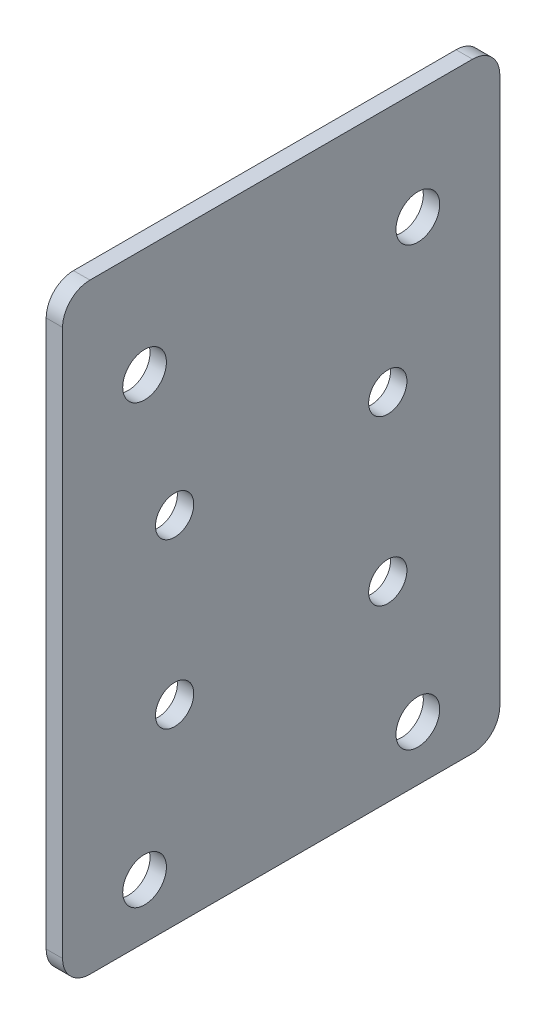
ISO-10303-21;
HEADER;
FILE_DESCRIPTION(('STEP AP214'),'2;1');
FILE_NAME('part.step','',(''),(''),'','','');
FILE_SCHEMA(('AUTOMOTIVE_DESIGN { 1 0 10303 214 1 1 1 1 }'));
ENDSEC;
DATA;
#1=APPLICATION_CONTEXT('core data for automotive mechanical design processes');
#2=APPLICATION_PROTOCOL_DEFINITION('international standard','automotive_design',2000,#1);
#3=PRODUCT_CONTEXT('',#1,'mechanical');
#4=PRODUCT('Part','Part','',(#3));
#5=PRODUCT_RELATED_PRODUCT_CATEGORY('part','',(#4));
#6=PRODUCT_DEFINITION_FORMATION('','',#4);
#7=PRODUCT_DEFINITION_CONTEXT('part definition',#1,'design');
#8=PRODUCT_DEFINITION('design','',#6,#7);
#9=PRODUCT_DEFINITION_SHAPE('','',#8);
#10=(LENGTH_UNIT() NAMED_UNIT(*) SI_UNIT(.MILLI.,.METRE.));
#11=(NAMED_UNIT(*) PLANE_ANGLE_UNIT() SI_UNIT($,.RADIAN.));
#12=(NAMED_UNIT(*) SI_UNIT($,.STERADIAN.) SOLID_ANGLE_UNIT());
#13=UNCERTAINTY_MEASURE_WITH_UNIT(LENGTH_MEASURE(1.E-05),#10,'distance_accuracy_value','');
#14=(GEOMETRIC_REPRESENTATION_CONTEXT(3) GLOBAL_UNCERTAINTY_ASSIGNED_CONTEXT((#13)) GLOBAL_UNIT_ASSIGNED_CONTEXT((#10,
#11,#12)) REPRESENTATION_CONTEXT('',''));
#15=CARTESIAN_POINT('',(0.,0.,0.));
#16=DIRECTION('',(0.,0.,1.));
#17=DIRECTION('',(1.,0.,0.));
#18=AXIS2_PLACEMENT_3D('',#15,#16,#17);
#19=CARTESIAN_POINT('',(0.,-23.2804933070191,40.));
#20=DIRECTION('',(0.,1.,0.));
#21=DIRECTION('',(0.,0.,1.));
#22=AXIS2_PLACEMENT_3D('',#19,#20,#21);
#23=PLANE('',#22);
#24=DIRECTION('',(0.,0.,-1.));
#25=VECTOR('',#24,1.);
#26=CARTESIAN_POINT('',(3.,-23.2804933070191,40.));
#27=LINE('',#26,#25);
#28=CARTESIAN_POINT('',(3.,-23.2804933070191,35.));
#29=VERTEX_POINT('',#28);
#30=CARTESIAN_POINT('',(3.,-23.2804933070191,-35.));
#31=VERTEX_POINT('',#30);
#32=EDGE_CURVE('E147',#29,#31,#27,.T.);
#33=ORIENTED_EDGE('',*,*,#32,.F.);
#34=DIRECTION('',(1.,0.,0.));
#35=VECTOR('',#34,1.);
#36=CARTESIAN_POINT('',(0.,-23.2804933070191,35.));
#37=LINE('',#36,#35);
#38=CARTESIAN_POINT('',(0.,-23.2804933070191,35.));
#39=VERTEX_POINT('',#38);
#40=EDGE_CURVE('E104',#29,#39,#37,.F.);
#41=ORIENTED_EDGE('',*,*,#40,.T.);
#42=DIRECTION('',(0.,0.,-1.));
#43=VECTOR('',#42,1.);
#44=CARTESIAN_POINT('',(0.,-23.2804933070191,40.));
#45=LINE('',#44,#43);
#46=CARTESIAN_POINT('',(0.,-23.2804933070191,-35.));
#47=VERTEX_POINT('',#46);
#48=EDGE_CURVE('E128',#39,#47,#45,.T.);
#49=ORIENTED_EDGE('',*,*,#48,.T.);
#50=DIRECTION('',(1.,0.,0.));
#51=VECTOR('',#50,1.);
#52=CARTESIAN_POINT('',(0.,-23.2804933070191,-35.));
#53=LINE('',#52,#51);
#54=EDGE_CURVE('E109',#47,#31,#53,.T.);
#55=ORIENTED_EDGE('',*,*,#54,.T.);
#56=EDGE_LOOP('',(#33,#41,#49,#55));
#57=FACE_BOUND('',#56,.T.);
#58=ADVANCED_FACE('F33',(#57),#23,.F.);
#59=CARTESIAN_POINT('',(3.,86.7195066929809,40.));
#60=DIRECTION('',(-1.,0.,0.));
#61=DIRECTION('',(0.,-1.,0.));
#62=AXIS2_PLACEMENT_3D('',#59,#60,#61);
#63=PLANE('',#62);
#64=CARTESIAN_POINT('',(3.00000000000004,66.7195066929809,24.9975001874844));
#65=DIRECTION('',(-1.,0.,0.));
#66=DIRECTION('',(0.,0.,1.));
#67=AXIS2_PLACEMENT_3D('',#64,#65,#66);
#68=CIRCLE('',#67,4.);
#69=CARTESIAN_POINT('',(3.00000000000004,66.7195066929809,28.9975001874844));
#70=VERTEX_POINT('',#69);
#71=EDGE_CURVE('E361',#70,#70,#68,.T.);
#72=ORIENTED_EDGE('',*,*,#71,.T.);
#73=EDGE_LOOP('',(#72));
#74=FACE_BOUND('',#73,.T.);
#75=CARTESIAN_POINT('',(3.00000000000004,-13.2804933070191,-25.));
#76=DIRECTION('',(-1.,0.,0.));
#77=DIRECTION('',(0.,0.,1.));
#78=AXIS2_PLACEMENT_3D('',#75,#76,#77);
#79=CIRCLE('',#78,4.);
#80=CARTESIAN_POINT('',(3.00000000000004,-13.2804933070191,-21.));
#81=VERTEX_POINT('',#80);
#82=EDGE_CURVE('E368',#81,#81,#79,.T.);
#83=ORIENTED_EDGE('',*,*,#82,.T.);
#84=EDGE_LOOP('',(#83));
#85=FACE_BOUND('',#84,.T.);
#86=CARTESIAN_POINT('',(3.00000000000004,-13.2804933070191,24.9975001874844));
#87=DIRECTION('',(-1.,0.,0.));
#88=DIRECTION('',(0.,0.,1.));
#89=AXIS2_PLACEMENT_3D('',#86,#87,#88);
#90=CIRCLE('',#89,4.);
#91=CARTESIAN_POINT('',(3.00000000000004,-13.2804933070191,28.9975001874844));
#92=VERTEX_POINT('',#91);
#93=EDGE_CURVE('E352',#92,#92,#90,.T.);
#94=ORIENTED_EDGE('',*,*,#93,.T.);
#95=EDGE_LOOP('',(#94));
#96=FACE_BOUND('',#95,.T.);
#97=CARTESIAN_POINT('',(3.00000000000004,66.7195066929809,-25.));
#98=DIRECTION('',(-1.,0.,0.));
#99=DIRECTION('',(0.,0.,1.));
#100=AXIS2_PLACEMENT_3D('',#97,#98,#99);
#101=CIRCLE('',#100,4.);
#102=CARTESIAN_POINT('',(3.00000000000004,66.7195066929809,-21.));
#103=VERTEX_POINT('',#102);
#104=EDGE_CURVE('E373',#103,#103,#101,.T.);
#105=ORIENTED_EDGE('',*,*,#104,.T.);
#106=EDGE_LOOP('',(#105));
#107=FACE_BOUND('',#106,.T.);
#108=CARTESIAN_POINT('',(3.00000000000004,41.7195066929809,19.5));
#109=DIRECTION('',(1.,0.,0.));
#110=DIRECTION('',(0.,0.,-1.));
#111=AXIS2_PLACEMENT_3D('',#108,#109,#110);
#112=CIRCLE('',#111,3.5);
#113=CARTESIAN_POINT('',(3.00000000000004,41.7195066929809,16.));
#114=VERTEX_POINT('',#113);
#115=EDGE_CURVE('E376',#114,#114,#112,.T.);
#116=ORIENTED_EDGE('',*,*,#115,.F.);
#117=EDGE_LOOP('',(#116));
#118=FACE_BOUND('',#117,.T.);
#119=CARTESIAN_POINT('',(3.00000000000004,41.719506692981,-19.5));
#120=DIRECTION('',(1.,0.,0.));
#121=DIRECTION('',(0.,0.,-1.));
#122=AXIS2_PLACEMENT_3D('',#119,#120,#121);
#123=CIRCLE('',#122,3.5);
#124=CARTESIAN_POINT('',(3.00000000000004,41.719506692981,-23.));
#125=VERTEX_POINT('',#124);
#126=EDGE_CURVE('E388',#125,#125,#123,.T.);
#127=ORIENTED_EDGE('',*,*,#126,.F.);
#128=EDGE_LOOP('',(#127));
#129=FACE_BOUND('',#128,.T.);
#130=CARTESIAN_POINT('',(3.00000000000004,11.7195066929809,-19.5));
#131=DIRECTION('',(1.,0.,0.));
#132=DIRECTION('',(0.,0.,-1.));
#133=AXIS2_PLACEMENT_3D('',#130,#131,#132);
#134=CIRCLE('',#133,3.5);
#135=CARTESIAN_POINT('',(3.00000000000004,11.7195066929809,-23.));
#136=VERTEX_POINT('',#135);
#137=EDGE_CURVE('E382',#136,#136,#134,.T.);
#138=ORIENTED_EDGE('',*,*,#137,.F.);
#139=EDGE_LOOP('',(#138));
#140=FACE_BOUND('',#139,.T.);
#141=CARTESIAN_POINT('',(3.00000000000004,11.7195066929809,19.5));
#142=DIRECTION('',(1.,0.,0.));
#143=DIRECTION('',(0.,0.,-1.));
#144=AXIS2_PLACEMENT_3D('',#141,#142,#143);
#145=CIRCLE('',#144,3.5);
#146=CARTESIAN_POINT('',(3.00000000000004,11.7195066929809,16.));
#147=VERTEX_POINT('',#146);
#148=EDGE_CURVE('E134',#147,#147,#145,.T.);
#149=ORIENTED_EDGE('',*,*,#148,.F.);
#150=EDGE_LOOP('',(#149));
#151=FACE_BOUND('',#150,.T.);
#152=DIRECTION('',(0.,1.,0.));
#153=VECTOR('',#152,1.);
#154=CARTESIAN_POINT('',(3.,-23.2804933070191,40.));
#155=LINE('',#154,#153);
#156=CARTESIAN_POINT('',(3.,-18.2804933070191,40.));
#157=VERTEX_POINT('',#156);
#158=CARTESIAN_POINT('',(3.,81.7195066929809,40.));
#159=VERTEX_POINT('',#158);
#160=EDGE_CURVE('E117',#157,#159,#155,.T.);
#161=ORIENTED_EDGE('',*,*,#160,.F.);
#162=CARTESIAN_POINT('',(3.00000000000004,-18.2804933070191,35.));
#163=DIRECTION('',(-1.,0.,0.));
#164=DIRECTION('',(0.,-1.,0.));
#165=AXIS2_PLACEMENT_3D('',#162,#163,#164);
#166=CIRCLE('',#165,5.);
#167=EDGE_CURVE('E99',#157,#29,#166,.F.);
#168=ORIENTED_EDGE('',*,*,#167,.T.);
#169=ORIENTED_EDGE('',*,*,#32,.T.);
#170=CARTESIAN_POINT('',(3.00000000000004,-18.2804933070191,-35.));
#171=DIRECTION('',(-1.,0.,0.));
#172=DIRECTION('',(0.,-1.,0.));
#173=AXIS2_PLACEMENT_3D('',#170,#171,#172);
#174=CIRCLE('',#173,5.);
#175=CARTESIAN_POINT('',(3.00000000000004,-18.2804933070191,-40.));
#176=VERTEX_POINT('',#175);
#177=EDGE_CURVE('E110',#31,#176,#174,.F.);
#178=ORIENTED_EDGE('',*,*,#177,.T.);
#179=DIRECTION('',(0.,1.,0.));
#180=VECTOR('',#179,1.);
#181=CARTESIAN_POINT('',(3.,86.7195066929809,-40.));
#182=LINE('',#181,#180);
#183=CARTESIAN_POINT('',(3.,81.7195066929809,-40.));
#184=VERTEX_POINT('',#183);
#185=EDGE_CURVE('E131',#176,#184,#182,.T.);
#186=ORIENTED_EDGE('',*,*,#185,.T.);
#187=CARTESIAN_POINT('',(3.,81.7195066929809,-35.));
#188=DIRECTION('',(-1.,0.,0.));
#189=DIRECTION('',(0.,-1.,0.));
#190=AXIS2_PLACEMENT_3D('',#187,#188,#189);
#191=CIRCLE('',#190,5.);
#192=CARTESIAN_POINT('',(3.,86.7195066929809,-35.));
#193=VERTEX_POINT('',#192);
#194=EDGE_CURVE('E151',#184,#193,#191,.F.);
#195=ORIENTED_EDGE('',*,*,#194,.T.);
#196=DIRECTION('',(0.,0.,-1.));
#197=VECTOR('',#196,1.);
#198=CARTESIAN_POINT('',(3.,86.7195066929809,40.));
#199=LINE('',#198,#197);
#200=CARTESIAN_POINT('',(3.,86.7195066929809,35.));
#201=VERTEX_POINT('',#200);
#202=EDGE_CURVE('E144',#201,#193,#199,.T.);
#203=ORIENTED_EDGE('',*,*,#202,.F.);
#204=CARTESIAN_POINT('',(3.,81.7195066929809,35.));
#205=DIRECTION('',(-1.,0.,0.));
#206=DIRECTION('',(0.,-1.,0.));
#207=AXIS2_PLACEMENT_3D('',#204,#205,#206);
#208=CIRCLE('',#207,5.);
#209=EDGE_CURVE('E120',#201,#159,#208,.F.);
#210=ORIENTED_EDGE('',*,*,#209,.T.);
#211=EDGE_LOOP('',(#161,#168,#169,#178,#186,#195,#203,#210));
#212=FACE_BOUND('',#211,.T.);
#213=ADVANCED_FACE('F123',(#74,#85,#96,#107,#118,#129,#140,#151,#212),#63,.F.);
#214=CARTESIAN_POINT('',(0.,86.7195066929809,40.));
#215=DIRECTION('',(0.,-1.,0.));
#216=DIRECTION('',(0.,0.,-1.));
#217=AXIS2_PLACEMENT_3D('',#214,#215,#216);
#218=PLANE('',#217);
#219=ORIENTED_EDGE('',*,*,#202,.T.);
#220=DIRECTION('',(-1.,0.,0.));
#221=VECTOR('',#220,1.);
#222=CARTESIAN_POINT('',(0.,86.7195066929809,-35.));
#223=LINE('',#222,#221);
#224=CARTESIAN_POINT('',(0.,86.7195066929809,-35.));
#225=VERTEX_POINT('',#224);
#226=EDGE_CURVE('E11',#193,#225,#223,.T.);
#227=ORIENTED_EDGE('',*,*,#226,.T.);
#228=DIRECTION('',(0.,0.,-1.));
#229=VECTOR('',#228,1.);
#230=CARTESIAN_POINT('',(0.,86.7195066929809,40.));
#231=LINE('',#230,#229);
#232=CARTESIAN_POINT('',(0.,86.7195066929809,35.));
#233=VERTEX_POINT('',#232);
#234=EDGE_CURVE('E142',#233,#225,#231,.T.);
#235=ORIENTED_EDGE('',*,*,#234,.F.);
#236=DIRECTION('',(-1.,0.,0.));
#237=VECTOR('',#236,1.);
#238=CARTESIAN_POINT('',(3.,86.7195066929809,35.));
#239=LINE('',#238,#237);
#240=EDGE_CURVE('E41',#233,#201,#239,.F.);
#241=ORIENTED_EDGE('',*,*,#240,.T.);
#242=EDGE_LOOP('',(#219,#227,#235,#241));
#243=FACE_BOUND('',#242,.T.);
#244=ADVANCED_FACE('F168',(#243),#218,.F.);
#245=CARTESIAN_POINT('',(0.,-23.2804933070191,40.));
#246=DIRECTION('',(1.,0.,0.));
#247=DIRECTION('',(0.,0.,-1.));
#248=AXIS2_PLACEMENT_3D('',#245,#246,#247);
#249=PLANE('',#248);
#250=CARTESIAN_POINT('',(0.,66.7195066929809,24.9975001874844));
#251=DIRECTION('',(-1.,0.,0.));
#252=DIRECTION('',(0.,0.,1.));
#253=AXIS2_PLACEMENT_3D('',#250,#251,#252);
#254=CIRCLE('',#253,4.);
#255=CARTESIAN_POINT('',(0.,66.7195066929809,28.9975001874844));
#256=VERTEX_POINT('',#255);
#257=EDGE_CURVE('E365',#256,#256,#254,.T.);
#258=ORIENTED_EDGE('',*,*,#257,.F.);
#259=EDGE_LOOP('',(#258));
#260=FACE_BOUND('',#259,.T.);
#261=CARTESIAN_POINT('',(0.,-13.2804933070191,-25.));
#262=DIRECTION('',(-1.,0.,0.));
#263=DIRECTION('',(0.,0.,1.));
#264=AXIS2_PLACEMENT_3D('',#261,#262,#263);
#265=CIRCLE('',#264,4.);
#266=CARTESIAN_POINT('',(0.,-13.2804933070191,-21.));
#267=VERTEX_POINT('',#266);
#268=EDGE_CURVE('E358',#267,#267,#265,.T.);
#269=ORIENTED_EDGE('',*,*,#268,.F.);
#270=EDGE_LOOP('',(#269));
#271=FACE_BOUND('',#270,.T.);
#272=CARTESIAN_POINT('',(0.,-13.2804933070191,24.9975001874844));
#273=DIRECTION('',(-1.,0.,0.));
#274=DIRECTION('',(0.,0.,1.));
#275=AXIS2_PLACEMENT_3D('',#272,#273,#274);
#276=CIRCLE('',#275,4.);
#277=CARTESIAN_POINT('',(0.,-13.2804933070191,28.9975001874844));
#278=VERTEX_POINT('',#277);
#279=EDGE_CURVE('E355',#278,#278,#276,.T.);
#280=ORIENTED_EDGE('',*,*,#279,.F.);
#281=EDGE_LOOP('',(#280));
#282=FACE_BOUND('',#281,.T.);
#283=CARTESIAN_POINT('',(0.,66.7195066929809,-25.));
#284=DIRECTION('',(-1.,0.,0.));
#285=DIRECTION('',(0.,0.,1.));
#286=AXIS2_PLACEMENT_3D('',#283,#284,#285);
#287=CIRCLE('',#286,4.);
#288=CARTESIAN_POINT('',(0.,66.7195066929809,-21.));
#289=VERTEX_POINT('',#288);
#290=EDGE_CURVE('E364',#289,#289,#287,.T.);
#291=ORIENTED_EDGE('',*,*,#290,.F.);
#292=EDGE_LOOP('',(#291));
#293=FACE_BOUND('',#292,.T.);
#294=CARTESIAN_POINT('',(0.,41.7195066929809,19.5));
#295=DIRECTION('',(1.,0.,0.));
#296=DIRECTION('',(0.,0.,-1.));
#297=AXIS2_PLACEMENT_3D('',#294,#295,#296);
#298=CIRCLE('',#297,3.5);
#299=CARTESIAN_POINT('',(0.,41.7195066929809,16.));
#300=VERTEX_POINT('',#299);
#301=EDGE_CURVE('E391',#300,#300,#298,.T.);
#302=ORIENTED_EDGE('',*,*,#301,.T.);
#303=EDGE_LOOP('',(#302));
#304=FACE_BOUND('',#303,.T.);
#305=CARTESIAN_POINT('',(0.,41.719506692981,-19.5));
#306=DIRECTION('',(1.,0.,0.));
#307=DIRECTION('',(0.,0.,-1.));
#308=AXIS2_PLACEMENT_3D('',#305,#306,#307);
#309=CIRCLE('',#308,3.5);
#310=CARTESIAN_POINT('',(0.,41.719506692981,-23.));
#311=VERTEX_POINT('',#310);
#312=EDGE_CURVE('E385',#311,#311,#309,.T.);
#313=ORIENTED_EDGE('',*,*,#312,.T.);
#314=EDGE_LOOP('',(#313));
#315=FACE_BOUND('',#314,.T.);
#316=CARTESIAN_POINT('',(0.,11.7195066929809,-19.5));
#317=DIRECTION('',(1.,0.,0.));
#318=DIRECTION('',(0.,0.,-1.));
#319=AXIS2_PLACEMENT_3D('',#316,#317,#318);
#320=CIRCLE('',#319,3.5);
#321=CARTESIAN_POINT('',(0.,11.7195066929809,-23.));
#322=VERTEX_POINT('',#321);
#323=EDGE_CURVE('E379',#322,#322,#320,.T.);
#324=ORIENTED_EDGE('',*,*,#323,.T.);
#325=EDGE_LOOP('',(#324));
#326=FACE_BOUND('',#325,.T.);
#327=CARTESIAN_POINT('',(0.,11.7195066929809,19.5));
#328=DIRECTION('',(1.,0.,0.));
#329=DIRECTION('',(0.,0.,-1.));
#330=AXIS2_PLACEMENT_3D('',#327,#328,#329);
#331=CIRCLE('',#330,3.5);
#332=CARTESIAN_POINT('',(0.,11.7195066929809,16.));
#333=VERTEX_POINT('',#332);
#334=EDGE_CURVE('E138',#333,#333,#331,.T.);
#335=ORIENTED_EDGE('',*,*,#334,.T.);
#336=EDGE_LOOP('',(#335));
#337=FACE_BOUND('',#336,.T.);
#338=ORIENTED_EDGE('',*,*,#48,.F.);
#339=CARTESIAN_POINT('',(0.,-18.2804933070191,35.));
#340=DIRECTION('',(1.,0.,0.));
#341=DIRECTION('',(0.,0.,-1.));
#342=AXIS2_PLACEMENT_3D('',#339,#340,#341);
#343=CIRCLE('',#342,5.);
#344=CARTESIAN_POINT('',(0.,-18.2804933070191,40.));
#345=VERTEX_POINT('',#344);
#346=EDGE_CURVE('E161',#39,#345,#343,.F.);
#347=ORIENTED_EDGE('',*,*,#346,.T.);
#348=DIRECTION('',(0.,-1.,0.));
#349=VECTOR('',#348,1.);
#350=CARTESIAN_POINT('',(0.,-23.2804933070191,40.));
#351=LINE('',#350,#349);
#352=CARTESIAN_POINT('',(0.,81.7195066929809,40.));
#353=VERTEX_POINT('',#352);
#354=EDGE_CURVE('E119',#353,#345,#351,.T.);
#355=ORIENTED_EDGE('',*,*,#354,.F.);
#356=CARTESIAN_POINT('',(0.,81.7195066929809,35.));
#357=DIRECTION('',(1.,0.,0.));
#358=DIRECTION('',(0.,0.,-1.));
#359=AXIS2_PLACEMENT_3D('',#356,#357,#358);
#360=CIRCLE('',#359,5.);
#361=EDGE_CURVE('E55',#353,#233,#360,.F.);
#362=ORIENTED_EDGE('',*,*,#361,.T.);
#363=ORIENTED_EDGE('',*,*,#234,.T.);
#364=CARTESIAN_POINT('',(0.,81.7195066929809,-35.));
#365=DIRECTION('',(1.,0.,0.));
#366=DIRECTION('',(0.,0.,-1.));
#367=AXIS2_PLACEMENT_3D('',#364,#365,#366);
#368=CIRCLE('',#367,5.);
#369=CARTESIAN_POINT('',(0.,81.7195066929809,-40.));
#370=VERTEX_POINT('',#369);
#371=EDGE_CURVE('E48',#225,#370,#368,.F.);
#372=ORIENTED_EDGE('',*,*,#371,.T.);
#373=DIRECTION('',(0.,-1.,0.));
#374=VECTOR('',#373,1.);
#375=CARTESIAN_POINT('',(0.,-23.2804933070191,-40.));
#376=LINE('',#375,#374);
#377=CARTESIAN_POINT('',(0.,-18.2804933070191,-40.));
#378=VERTEX_POINT('',#377);
#379=EDGE_CURVE('E126',#370,#378,#376,.T.);
#380=ORIENTED_EDGE('',*,*,#379,.T.);
#381=CARTESIAN_POINT('',(0.,-18.2804933070191,-35.));
#382=DIRECTION('',(1.,0.,0.));
#383=DIRECTION('',(0.,0.,-1.));
#384=AXIS2_PLACEMENT_3D('',#381,#382,#383);
#385=CIRCLE('',#384,5.);
#386=EDGE_CURVE('E159',#378,#47,#385,.F.);
#387=ORIENTED_EDGE('',*,*,#386,.T.);
#388=EDGE_LOOP('',(#338,#347,#355,#362,#363,#372,#380,#387));
#389=FACE_BOUND('',#388,.T.);
#390=ADVANCED_FACE('F172',(#260,#271,#282,#293,#304,#315,#326,#337,#389),#249,.F.);
#391=CARTESIAN_POINT('',(0.,0.,40.));
#392=DIRECTION('',(0.,0.,1.));
#393=DIRECTION('',(1.,0.,0.));
#394=AXIS2_PLACEMENT_3D('',#391,#392,#393);
#395=PLANE('',#394);
#396=ORIENTED_EDGE('',*,*,#354,.T.);
#397=DIRECTION('',(1.,0.,0.));
#398=VECTOR('',#397,1.);
#399=CARTESIAN_POINT('',(3.,-18.2804933070191,40.));
#400=LINE('',#399,#398);
#401=EDGE_CURVE('E103',#345,#157,#400,.T.);
#402=ORIENTED_EDGE('',*,*,#401,.T.);
#403=ORIENTED_EDGE('',*,*,#160,.T.);
#404=DIRECTION('',(-1.,0.,0.));
#405=VECTOR('',#404,1.);
#406=CARTESIAN_POINT('',(0.,81.7195066929809,40.));
#407=LINE('',#406,#405);
#408=EDGE_CURVE('E121',#159,#353,#407,.T.);
#409=ORIENTED_EDGE('',*,*,#408,.T.);
#410=EDGE_LOOP('',(#396,#402,#403,#409));
#411=FACE_BOUND('',#410,.T.);
#412=ADVANCED_FACE('F115',(#411),#395,.T.);
#413=CARTESIAN_POINT('',(0.,0.,-40.));
#414=DIRECTION('',(0.,0.,1.));
#415=DIRECTION('',(1.,0.,0.));
#416=AXIS2_PLACEMENT_3D('',#413,#414,#415);
#417=PLANE('',#416);
#418=ORIENTED_EDGE('',*,*,#185,.F.);
#419=DIRECTION('',(1.,0.,0.));
#420=VECTOR('',#419,1.);
#421=CARTESIAN_POINT('',(0.,-18.2804933070191,-40.));
#422=LINE('',#421,#420);
#423=EDGE_CURVE('E165',#176,#378,#422,.F.);
#424=ORIENTED_EDGE('',*,*,#423,.T.);
#425=ORIENTED_EDGE('',*,*,#379,.F.);
#426=DIRECTION('',(-1.,0.,0.));
#427=VECTOR('',#426,1.);
#428=CARTESIAN_POINT('',(0.,81.7195066929809,-40.));
#429=LINE('',#428,#427);
#430=EDGE_CURVE('E163',#370,#184,#429,.F.);
#431=ORIENTED_EDGE('',*,*,#430,.T.);
#432=EDGE_LOOP('',(#418,#424,#425,#431));
#433=FACE_BOUND('',#432,.T.);
#434=ADVANCED_FACE('F181',(#433),#417,.F.);
#435=CARTESIAN_POINT('',(0.,11.7195066929809,19.5));
#436=DIRECTION('',(1.,0.,0.));
#437=DIRECTION('',(0.,0.,-1.));
#438=AXIS2_PLACEMENT_3D('',#435,#436,#437);
#439=CYLINDRICAL_SURFACE('',#438,3.5);
#440=ORIENTED_EDGE('',*,*,#334,.F.);
#441=EDGE_LOOP('',(#440));
#442=FACE_BOUND('',#441,.T.);
#443=ORIENTED_EDGE('',*,*,#148,.T.);
#444=EDGE_LOOP('',(#443));
#445=FACE_BOUND('',#444,.T.);
#446=ADVANCED_FACE('F226',(#442,#445),#439,.F.);
#447=CARTESIAN_POINT('',(0.,11.7195066929809,-19.5));
#448=DIRECTION('',(1.,0.,0.));
#449=DIRECTION('',(0.,0.,-1.));
#450=AXIS2_PLACEMENT_3D('',#447,#448,#449);
#451=CYLINDRICAL_SURFACE('',#450,3.5);
#452=ORIENTED_EDGE('',*,*,#323,.F.);
#453=EDGE_LOOP('',(#452));
#454=FACE_BOUND('',#453,.T.);
#455=ORIENTED_EDGE('',*,*,#137,.T.);
#456=EDGE_LOOP('',(#455));
#457=FACE_BOUND('',#456,.T.);
#458=ADVANCED_FACE('F222',(#454,#457),#451,.F.);
#459=CARTESIAN_POINT('',(0.,41.719506692981,-19.5));
#460=DIRECTION('',(1.,0.,0.));
#461=DIRECTION('',(0.,0.,-1.));
#462=AXIS2_PLACEMENT_3D('',#459,#460,#461);
#463=CYLINDRICAL_SURFACE('',#462,3.5);
#464=ORIENTED_EDGE('',*,*,#312,.F.);
#465=EDGE_LOOP('',(#464));
#466=FACE_BOUND('',#465,.T.);
#467=ORIENTED_EDGE('',*,*,#126,.T.);
#468=EDGE_LOOP('',(#467));
#469=FACE_BOUND('',#468,.T.);
#470=ADVANCED_FACE('F225',(#466,#469),#463,.F.);
#471=CARTESIAN_POINT('',(0.,41.7195066929809,19.5));
#472=DIRECTION('',(1.,0.,0.));
#473=DIRECTION('',(0.,0.,-1.));
#474=AXIS2_PLACEMENT_3D('',#471,#472,#473);
#475=CYLINDRICAL_SURFACE('',#474,3.5);
#476=ORIENTED_EDGE('',*,*,#301,.F.);
#477=EDGE_LOOP('',(#476));
#478=FACE_BOUND('',#477,.T.);
#479=ORIENTED_EDGE('',*,*,#115,.T.);
#480=EDGE_LOOP('',(#479));
#481=FACE_BOUND('',#480,.T.);
#482=ADVANCED_FACE('F220',(#478,#481),#475,.F.);
#483=CARTESIAN_POINT('',(3.00000000000004,66.7195066929809,-25.));
#484=DIRECTION('',(-1.,0.,0.));
#485=DIRECTION('',(0.,0.,1.));
#486=AXIS2_PLACEMENT_3D('',#483,#484,#485);
#487=CYLINDRICAL_SURFACE('',#486,4.);
#488=ORIENTED_EDGE('',*,*,#104,.F.);
#489=EDGE_LOOP('',(#488));
#490=FACE_BOUND('',#489,.T.);
#491=ORIENTED_EDGE('',*,*,#290,.T.);
#492=EDGE_LOOP('',(#491));
#493=FACE_BOUND('',#492,.T.);
#494=ADVANCED_FACE('F217',(#490,#493),#487,.F.);
#495=CARTESIAN_POINT('',(3.00000000000004,-13.2804933070191,24.9975001874844));
#496=DIRECTION('',(-1.,0.,0.));
#497=DIRECTION('',(0.,0.,1.));
#498=AXIS2_PLACEMENT_3D('',#495,#496,#497);
#499=CYLINDRICAL_SURFACE('',#498,4.);
#500=ORIENTED_EDGE('',*,*,#93,.F.);
#501=EDGE_LOOP('',(#500));
#502=FACE_BOUND('',#501,.T.);
#503=ORIENTED_EDGE('',*,*,#279,.T.);
#504=EDGE_LOOP('',(#503));
#505=FACE_BOUND('',#504,.T.);
#506=ADVANCED_FACE('F210',(#502,#505),#499,.F.);
#507=CARTESIAN_POINT('',(3.00000000000004,-13.2804933070191,-25.));
#508=DIRECTION('',(-1.,0.,0.));
#509=DIRECTION('',(0.,0.,1.));
#510=AXIS2_PLACEMENT_3D('',#507,#508,#509);
#511=CYLINDRICAL_SURFACE('',#510,4.);
#512=ORIENTED_EDGE('',*,*,#82,.F.);
#513=EDGE_LOOP('',(#512));
#514=FACE_BOUND('',#513,.T.);
#515=ORIENTED_EDGE('',*,*,#268,.T.);
#516=EDGE_LOOP('',(#515));
#517=FACE_BOUND('',#516,.T.);
#518=ADVANCED_FACE('F204',(#514,#517),#511,.F.);
#519=CARTESIAN_POINT('',(3.00000000000004,66.7195066929809,24.9975001874844));
#520=DIRECTION('',(-1.,0.,0.));
#521=DIRECTION('',(0.,0.,1.));
#522=AXIS2_PLACEMENT_3D('',#519,#520,#521);
#523=CYLINDRICAL_SURFACE('',#522,4.);
#524=ORIENTED_EDGE('',*,*,#71,.F.);
#525=EDGE_LOOP('',(#524));
#526=FACE_BOUND('',#525,.T.);
#527=ORIENTED_EDGE('',*,*,#257,.T.);
#528=EDGE_LOOP('',(#527));
#529=FACE_BOUND('',#528,.T.);
#530=ADVANCED_FACE('F200',(#526,#529),#523,.F.);
#531=CARTESIAN_POINT('',(0.,-18.2804933070191,35.));
#532=DIRECTION('',(-1.,0.,0.));
#533=DIRECTION('',(0.,0.,1.));
#534=AXIS2_PLACEMENT_3D('',#531,#532,#533);
#535=CYLINDRICAL_SURFACE('',#534,5.);
#536=ORIENTED_EDGE('',*,*,#346,.F.);
#537=ORIENTED_EDGE('',*,*,#40,.F.);
#538=ORIENTED_EDGE('',*,*,#167,.F.);
#539=ORIENTED_EDGE('',*,*,#401,.F.);
#540=EDGE_LOOP('',(#536,#537,#538,#539));
#541=FACE_BOUND('',#540,.T.);
#542=ADVANCED_FACE('F102',(#541),#535,.T.);
#543=CARTESIAN_POINT('',(0.,-18.2804933070191,-35.));
#544=DIRECTION('',(1.,0.,0.));
#545=DIRECTION('',(0.,0.,-1.));
#546=AXIS2_PLACEMENT_3D('',#543,#544,#545);
#547=CYLINDRICAL_SURFACE('',#546,5.);
#548=ORIENTED_EDGE('',*,*,#386,.F.);
#549=ORIENTED_EDGE('',*,*,#423,.F.);
#550=ORIENTED_EDGE('',*,*,#177,.F.);
#551=ORIENTED_EDGE('',*,*,#54,.F.);
#552=EDGE_LOOP('',(#548,#549,#550,#551));
#553=FACE_BOUND('',#552,.T.);
#554=ADVANCED_FACE('F177',(#553),#547,.T.);
#555=CARTESIAN_POINT('',(0.,81.7195066929809,-35.));
#556=DIRECTION('',(-1.,0.,0.));
#557=DIRECTION('',(0.,0.,1.));
#558=AXIS2_PLACEMENT_3D('',#555,#556,#557);
#559=CYLINDRICAL_SURFACE('',#558,5.);
#560=ORIENTED_EDGE('',*,*,#194,.F.);
#561=ORIENTED_EDGE('',*,*,#430,.F.);
#562=ORIENTED_EDGE('',*,*,#371,.F.);
#563=ORIENTED_EDGE('',*,*,#226,.F.);
#564=EDGE_LOOP('',(#560,#561,#562,#563));
#565=FACE_BOUND('',#564,.T.);
#566=ADVANCED_FACE('F183',(#565),#559,.T.);
#567=CARTESIAN_POINT('',(0.,81.7195066929809,35.));
#568=DIRECTION('',(1.,0.,0.));
#569=DIRECTION('',(0.,0.,-1.));
#570=AXIS2_PLACEMENT_3D('',#567,#568,#569);
#571=CYLINDRICAL_SURFACE('',#570,5.);
#572=ORIENTED_EDGE('',*,*,#209,.F.);
#573=ORIENTED_EDGE('',*,*,#240,.F.);
#574=ORIENTED_EDGE('',*,*,#361,.F.);
#575=ORIENTED_EDGE('',*,*,#408,.F.);
#576=EDGE_LOOP('',(#572,#573,#574,#575));
#577=FACE_BOUND('',#576,.T.);
#578=ADVANCED_FACE('F35',(#577),#571,.T.);
#579=CLOSED_SHELL('',(#58,#213,#244,#390,#412,#434,#446,#458,#470,#482,#494,#506,#518,#530,#542,
#554,#566,#578));
#580=MANIFOLD_SOLID_BREP('B2',#579);
#581=ADVANCED_BREP_SHAPE_REPRESENTATION('',(#18,#580),#14);
#582=SHAPE_DEFINITION_REPRESENTATION(#9,#581);
ENDSEC;
END-ISO-10303-21;
